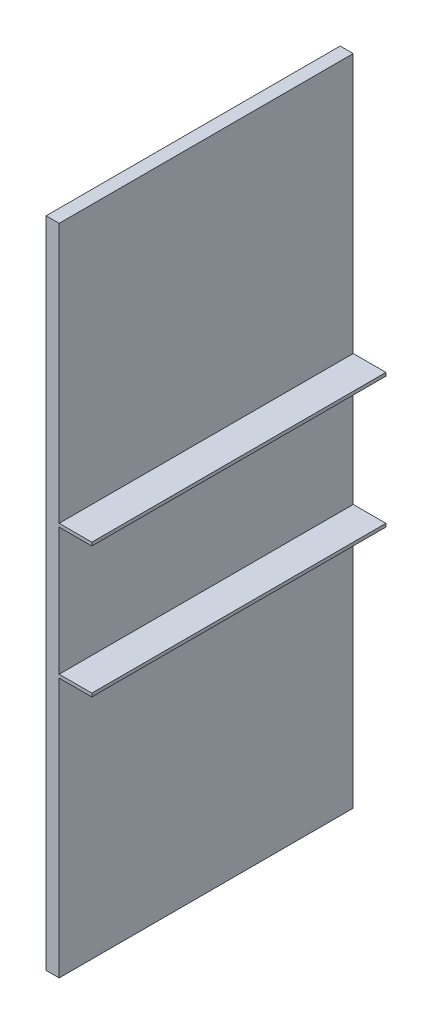
ISO-10303-21;
HEADER;
FILE_DESCRIPTION(('STEP AP214'),'2;1');
FILE_NAME('part.step','',(''),(''),'','','');
FILE_SCHEMA(('AUTOMOTIVE_DESIGN { 1 0 10303 214 1 1 1 1 }'));
ENDSEC;
DATA;
#1=APPLICATION_CONTEXT('core data for automotive mechanical design processes');
#2=APPLICATION_PROTOCOL_DEFINITION('international standard','automotive_design',2000,#1);
#3=PRODUCT_CONTEXT('',#1,'mechanical');
#4=PRODUCT('Part','Part','',(#3));
#5=PRODUCT_RELATED_PRODUCT_CATEGORY('part','',(#4));
#6=PRODUCT_DEFINITION_FORMATION('','',#4);
#7=PRODUCT_DEFINITION_CONTEXT('part definition',#1,'design');
#8=PRODUCT_DEFINITION('design','',#6,#7);
#9=PRODUCT_DEFINITION_SHAPE('','',#8);
#10=(LENGTH_UNIT() NAMED_UNIT(*) SI_UNIT(.MILLI.,.METRE.));
#11=(NAMED_UNIT(*) PLANE_ANGLE_UNIT() SI_UNIT($,.RADIAN.));
#12=(NAMED_UNIT(*) SI_UNIT($,.STERADIAN.) SOLID_ANGLE_UNIT());
#13=UNCERTAINTY_MEASURE_WITH_UNIT(LENGTH_MEASURE(1.E-05),#10,'distance_accuracy_value','');
#14=(GEOMETRIC_REPRESENTATION_CONTEXT(3) GLOBAL_UNCERTAINTY_ASSIGNED_CONTEXT((#13)) GLOBAL_UNIT_ASSIGNED_CONTEXT((#10,
#11,#12)) REPRESENTATION_CONTEXT('',''));
#15=CARTESIAN_POINT('',(0.,0.,0.));
#16=DIRECTION('',(0.,0.,1.));
#17=DIRECTION('',(1.,0.,0.));
#18=AXIS2_PLACEMENT_3D('',#15,#16,#17);
#19=CARTESIAN_POINT('',(-3.,0.,-45.));
#20=DIRECTION('',(-1.,0.,0.));
#21=DIRECTION('',(0.,0.,1.));
#22=AXIS2_PLACEMENT_3D('',#19,#20,#21);
#23=PLANE('',#22);
#24=DIRECTION('',(0.,0.,-1.));
#25=VECTOR('',#24,1.);
#26=CARTESIAN_POINT('',(-2.99999999999999,79.5,45.));
#27=LINE('',#26,#25);
#28=CARTESIAN_POINT('',(-2.99999999999999,79.5,45.));
#29=VERTEX_POINT('',#28);
#30=CARTESIAN_POINT('',(-3.,79.5,-45.));
#31=VERTEX_POINT('',#30);
#32=EDGE_CURVE('E246',#29,#31,#27,.T.);
#33=ORIENTED_EDGE('',*,*,#32,.F.);
#34=DIRECTION('',(0.,1.,0.));
#35=VECTOR('',#34,1.);
#36=CARTESIAN_POINT('',(-2.99999999999999,0.,45.));
#37=LINE('',#36,#35);
#38=CARTESIAN_POINT('',(-3.,0.,45.));
#39=VERTEX_POINT('',#38);
#40=EDGE_CURVE('E145',#39,#29,#37,.T.);
#41=ORIENTED_EDGE('',*,*,#40,.F.);
#42=DIRECTION('',(0.,0.,1.));
#43=VECTOR('',#42,1.);
#44=CARTESIAN_POINT('',(-3.,0.,-45.));
#45=LINE('',#44,#43);
#46=CARTESIAN_POINT('',(-3.,0.,-45.));
#47=VERTEX_POINT('',#46);
#48=EDGE_CURVE('E237',#47,#39,#45,.T.);
#49=ORIENTED_EDGE('',*,*,#48,.F.);
#50=DIRECTION('',(0.,1.,0.));
#51=VECTOR('',#50,1.);
#52=CARTESIAN_POINT('',(-3.,0.,-45.));
#53=LINE('',#52,#51);
#54=EDGE_CURVE('E235',#47,#31,#53,.T.);
#55=ORIENTED_EDGE('',*,*,#54,.T.);
#56=EDGE_LOOP('',(#33,#41,#49,#55));
#57=FACE_BOUND('',#56,.T.);
#58=ADVANCED_FACE('F32',(#57),#23,.F.);
#59=DIRECTION('',(0.,0.,1.));
#60=VECTOR('',#59,1.);
#61=CARTESIAN_POINT('',(-2.99999999999999,80.5,45.));
#62=LINE('',#61,#60);
#63=CARTESIAN_POINT('',(-3.,80.5,-45.));
#64=VERTEX_POINT('',#63);
#65=CARTESIAN_POINT('',(-2.99999999999999,80.5,45.));
#66=VERTEX_POINT('',#65);
#67=EDGE_CURVE('E140',#64,#66,#62,.T.);
#68=ORIENTED_EDGE('',*,*,#67,.F.);
#69=CARTESIAN_POINT('',(-3.,119.5,-45.));
#70=VERTEX_POINT('',#69);
#71=EDGE_CURVE('E36',#64,#70,#53,.T.);
#72=ORIENTED_EDGE('',*,*,#71,.T.);
#73=DIRECTION('',(0.,0.,-1.));
#74=VECTOR('',#73,1.);
#75=CARTESIAN_POINT('',(-2.99999999999999,119.5,45.));
#76=LINE('',#75,#74);
#77=CARTESIAN_POINT('',(-2.99999999999999,119.5,45.));
#78=VERTEX_POINT('',#77);
#79=EDGE_CURVE('E146',#78,#70,#76,.T.);
#80=ORIENTED_EDGE('',*,*,#79,.F.);
#81=EDGE_CURVE('E192',#66,#78,#37,.T.);
#82=ORIENTED_EDGE('',*,*,#81,.F.);
#83=EDGE_LOOP('',(#68,#72,#80,#82));
#84=FACE_BOUND('',#83,.T.);
#85=ADVANCED_FACE('F261',(#84),#23,.F.);
#86=DIRECTION('',(0.,0.,1.));
#87=VECTOR('',#86,1.);
#88=CARTESIAN_POINT('',(-2.99999999999999,120.5,45.));
#89=LINE('',#88,#87);
#90=CARTESIAN_POINT('',(-3.,120.5,-45.));
#91=VERTEX_POINT('',#90);
#92=CARTESIAN_POINT('',(-2.99999999999999,120.5,45.));
#93=VERTEX_POINT('',#92);
#94=EDGE_CURVE('E58',#91,#93,#89,.T.);
#95=ORIENTED_EDGE('',*,*,#94,.F.);
#96=CARTESIAN_POINT('',(-3.,200.,-45.));
#97=VERTEX_POINT('',#96);
#98=EDGE_CURVE('E170',#91,#97,#53,.T.);
#99=ORIENTED_EDGE('',*,*,#98,.T.);
#100=DIRECTION('',(0.,0.,1.));
#101=VECTOR('',#100,1.);
#102=CARTESIAN_POINT('',(-3.,200.,-45.));
#103=LINE('',#102,#101);
#104=CARTESIAN_POINT('',(-2.99999999999999,200.,45.));
#105=VERTEX_POINT('',#104);
#106=EDGE_CURVE('E181',#97,#105,#103,.T.);
#107=ORIENTED_EDGE('',*,*,#106,.T.);
#108=EDGE_CURVE('E194',#93,#105,#37,.T.);
#109=ORIENTED_EDGE('',*,*,#108,.F.);
#110=EDGE_LOOP('',(#95,#99,#107,#109));
#111=FACE_BOUND('',#110,.T.);
#112=ADVANCED_FACE('F236',(#111),#23,.F.);
#113=CARTESIAN_POINT('',(-7.,200.,-45.));
#114=DIRECTION('',(0.,0.,1.));
#115=DIRECTION('',(1.,0.,0.));
#116=AXIS2_PLACEMENT_3D('',#113,#114,#115);
#117=PLANE('',#116);
#118=DIRECTION('',(-1.,0.,0.));
#119=VECTOR('',#118,1.);
#120=CARTESIAN_POINT('',(-7.,200.,-45.));
#121=LINE('',#120,#119);
#122=CARTESIAN_POINT('',(-7.,200.,-45.));
#123=VERTEX_POINT('',#122);
#124=EDGE_CURVE('E210',#97,#123,#121,.T.);
#125=ORIENTED_EDGE('',*,*,#124,.F.);
#126=ORIENTED_EDGE('',*,*,#98,.F.);
#127=DIRECTION('',(-1.,0.,0.));
#128=VECTOR('',#127,1.);
#129=CARTESIAN_POINT('',(7.,120.5,-45.));
#130=LINE('',#129,#128);
#131=CARTESIAN_POINT('',(7.,120.5,-45.));
#132=VERTEX_POINT('',#131);
#133=EDGE_CURVE('E176',#132,#91,#130,.T.);
#134=ORIENTED_EDGE('',*,*,#133,.F.);
#135=DIRECTION('',(0.,1.,0.));
#136=VECTOR('',#135,1.);
#137=CARTESIAN_POINT('',(7.,120.5,-45.));
#138=LINE('',#137,#136);
#139=CARTESIAN_POINT('',(7.,119.5,-45.));
#140=VERTEX_POINT('',#139);
#141=EDGE_CURVE('E159',#140,#132,#138,.T.);
#142=ORIENTED_EDGE('',*,*,#141,.F.);
#143=DIRECTION('',(-1.,0.,0.));
#144=VECTOR('',#143,1.);
#145=CARTESIAN_POINT('',(7.,119.5,-45.));
#146=LINE('',#145,#144);
#147=EDGE_CURVE('E172',#140,#70,#146,.T.);
#148=ORIENTED_EDGE('',*,*,#147,.T.);
#149=ORIENTED_EDGE('',*,*,#71,.F.);
#150=DIRECTION('',(-1.,0.,0.));
#151=VECTOR('',#150,1.);
#152=CARTESIAN_POINT('',(7.,80.5,-45.));
#153=LINE('',#152,#151);
#154=CARTESIAN_POINT('',(7.,80.5,-45.));
#155=VERTEX_POINT('',#154);
#156=EDGE_CURVE('E150',#155,#64,#153,.T.);
#157=ORIENTED_EDGE('',*,*,#156,.F.);
#158=DIRECTION('',(0.,1.,0.));
#159=VECTOR('',#158,1.);
#160=CARTESIAN_POINT('',(7.,79.5,-45.));
#161=LINE('',#160,#159);
#162=CARTESIAN_POINT('',(7.,79.5,-45.));
#163=VERTEX_POINT('',#162);
#164=EDGE_CURVE('E134',#163,#155,#161,.T.);
#165=ORIENTED_EDGE('',*,*,#164,.F.);
#166=DIRECTION('',(-1.,0.,0.));
#167=VECTOR('',#166,1.);
#168=CARTESIAN_POINT('',(7.,79.5,-45.));
#169=LINE('',#168,#167);
#170=EDGE_CURVE('E131',#163,#31,#169,.T.);
#171=ORIENTED_EDGE('',*,*,#170,.T.);
#172=ORIENTED_EDGE('',*,*,#54,.F.);
#173=DIRECTION('',(-1.,0.,0.));
#174=VECTOR('',#173,1.);
#175=CARTESIAN_POINT('',(-7.,0.,-45.));
#176=LINE('',#175,#174);
#177=CARTESIAN_POINT('',(-7.,0.,-45.));
#178=VERTEX_POINT('',#177);
#179=EDGE_CURVE('E203',#47,#178,#176,.T.);
#180=ORIENTED_EDGE('',*,*,#179,.T.);
#181=DIRECTION('',(0.,-1.,0.));
#182=VECTOR('',#181,1.);
#183=CARTESIAN_POINT('',(-7.,200.,-45.));
#184=LINE('',#183,#182);
#185=EDGE_CURVE('E11',#123,#178,#184,.T.);
#186=ORIENTED_EDGE('',*,*,#185,.F.);
#187=EDGE_LOOP('',(#125,#126,#134,#142,#148,#149,#157,#165,#171,#172,#180,#186));
#188=FACE_BOUND('',#187,.T.);
#189=ADVANCED_FACE('F34',(#188),#117,.F.);
#190=CARTESIAN_POINT('',(-7.,200.,-45.));
#191=DIRECTION('',(1.,0.,0.));
#192=DIRECTION('',(0.,0.,-1.));
#193=AXIS2_PLACEMENT_3D('',#190,#191,#192);
#194=PLANE('',#193);
#195=DIRECTION('',(0.,0.,1.));
#196=VECTOR('',#195,1.);
#197=CARTESIAN_POINT('',(-7.,0.,-45.));
#198=LINE('',#197,#196);
#199=CARTESIAN_POINT('',(-6.99999999999999,0.,45.));
#200=VERTEX_POINT('',#199);
#201=EDGE_CURVE('E211',#178,#200,#198,.T.);
#202=ORIENTED_EDGE('',*,*,#201,.T.);
#203=DIRECTION('',(0.,-1.,0.));
#204=VECTOR('',#203,1.);
#205=CARTESIAN_POINT('',(-6.99999999999999,200.,45.));
#206=LINE('',#205,#204);
#207=CARTESIAN_POINT('',(-6.99999999999999,200.,45.));
#208=VERTEX_POINT('',#207);
#209=EDGE_CURVE('E42',#208,#200,#206,.T.);
#210=ORIENTED_EDGE('',*,*,#209,.F.);
#211=DIRECTION('',(0.,0.,1.));
#212=VECTOR('',#211,1.);
#213=CARTESIAN_POINT('',(-7.,200.,-45.));
#214=LINE('',#213,#212);
#215=EDGE_CURVE('E216',#123,#208,#214,.T.);
#216=ORIENTED_EDGE('',*,*,#215,.F.);
#217=ORIENTED_EDGE('',*,*,#185,.T.);
#218=EDGE_LOOP('',(#202,#210,#216,#217));
#219=FACE_BOUND('',#218,.T.);
#220=ADVANCED_FACE('F230',(#219),#194,.F.);
#221=CARTESIAN_POINT('',(-6.99999999999999,200.,45.));
#222=DIRECTION('',(0.,0.,-1.));
#223=DIRECTION('',(-1.,0.,0.));
#224=AXIS2_PLACEMENT_3D('',#221,#222,#223);
#225=PLANE('',#224);
#226=DIRECTION('',(1.,0.,0.));
#227=VECTOR('',#226,1.);
#228=CARTESIAN_POINT('',(-6.99999999999999,0.,45.));
#229=LINE('',#228,#227);
#230=EDGE_CURVE('E208',#200,#39,#229,.T.);
#231=ORIENTED_EDGE('',*,*,#230,.T.);
#232=ORIENTED_EDGE('',*,*,#40,.T.);
#233=DIRECTION('',(-1.,0.,0.));
#234=VECTOR('',#233,1.);
#235=CARTESIAN_POINT('',(7.00000000000001,79.5,45.));
#236=LINE('',#235,#234);
#237=CARTESIAN_POINT('',(7.00000000000001,79.5,45.));
#238=VERTEX_POINT('',#237);
#239=EDGE_CURVE('E128',#238,#29,#236,.T.);
#240=ORIENTED_EDGE('',*,*,#239,.F.);
#241=DIRECTION('',(0.,-1.,0.));
#242=VECTOR('',#241,1.);
#243=CARTESIAN_POINT('',(7.00000000000001,79.5,45.));
#244=LINE('',#243,#242);
#245=CARTESIAN_POINT('',(7.00000000000001,80.5,45.));
#246=VERTEX_POINT('',#245);
#247=EDGE_CURVE('E135',#246,#238,#244,.T.);
#248=ORIENTED_EDGE('',*,*,#247,.F.);
#249=DIRECTION('',(-1.,0.,0.));
#250=VECTOR('',#249,1.);
#251=CARTESIAN_POINT('',(7.00000000000001,80.5,45.));
#252=LINE('',#251,#250);
#253=EDGE_CURVE('E50',#246,#66,#252,.T.);
#254=ORIENTED_EDGE('',*,*,#253,.T.);
#255=ORIENTED_EDGE('',*,*,#81,.T.);
#256=DIRECTION('',(-1.,0.,0.));
#257=VECTOR('',#256,1.);
#258=CARTESIAN_POINT('',(7.00000000000001,119.5,45.));
#259=LINE('',#258,#257);
#260=CARTESIAN_POINT('',(7.00000000000001,119.5,45.));
#261=VERTEX_POINT('',#260);
#262=EDGE_CURVE('E175',#261,#78,#259,.T.);
#263=ORIENTED_EDGE('',*,*,#262,.F.);
#264=DIRECTION('',(0.,-1.,0.));
#265=VECTOR('',#264,1.);
#266=CARTESIAN_POINT('',(7.00000000000001,120.5,45.));
#267=LINE('',#266,#265);
#268=CARTESIAN_POINT('',(7.00000000000001,120.5,45.));
#269=VERTEX_POINT('',#268);
#270=EDGE_CURVE('E154',#269,#261,#267,.T.);
#271=ORIENTED_EDGE('',*,*,#270,.F.);
#272=DIRECTION('',(-1.,0.,0.));
#273=VECTOR('',#272,1.);
#274=CARTESIAN_POINT('',(7.00000000000001,120.5,45.));
#275=LINE('',#274,#273);
#276=EDGE_CURVE('E163',#269,#93,#275,.T.);
#277=ORIENTED_EDGE('',*,*,#276,.T.);
#278=ORIENTED_EDGE('',*,*,#108,.T.);
#279=DIRECTION('',(1.,0.,0.));
#280=VECTOR('',#279,1.);
#281=CARTESIAN_POINT('',(-6.99999999999999,200.,45.));
#282=LINE('',#281,#280);
#283=EDGE_CURVE('E207',#208,#105,#282,.T.);
#284=ORIENTED_EDGE('',*,*,#283,.F.);
#285=ORIENTED_EDGE('',*,*,#209,.T.);
#286=EDGE_LOOP('',(#231,#232,#240,#248,#254,#255,#263,#271,#277,#278,#284,#285));
#287=FACE_BOUND('',#286,.T.);
#288=ADVANCED_FACE('F144',(#287),#225,.F.);
#289=CARTESIAN_POINT('',(0.,200.,0.));
#290=DIRECTION('',(0.,1.,0.));
#291=DIRECTION('',(0.,0.,1.));
#292=AXIS2_PLACEMENT_3D('',#289,#290,#291);
#293=PLANE('',#292);
#294=ORIENTED_EDGE('',*,*,#106,.F.);
#295=ORIENTED_EDGE('',*,*,#124,.T.);
#296=ORIENTED_EDGE('',*,*,#215,.T.);
#297=ORIENTED_EDGE('',*,*,#283,.T.);
#298=EDGE_LOOP('',(#294,#295,#296,#297));
#299=FACE_BOUND('',#298,.T.);
#300=ADVANCED_FACE('F221',(#299),#293,.T.);
#301=CARTESIAN_POINT('',(0.,0.,0.));
#302=DIRECTION('',(0.,1.,0.));
#303=DIRECTION('',(0.,0.,1.));
#304=AXIS2_PLACEMENT_3D('',#301,#302,#303);
#305=PLANE('',#304);
#306=ORIENTED_EDGE('',*,*,#179,.F.);
#307=ORIENTED_EDGE('',*,*,#48,.T.);
#308=ORIENTED_EDGE('',*,*,#230,.F.);
#309=ORIENTED_EDGE('',*,*,#201,.F.);
#310=EDGE_LOOP('',(#306,#307,#308,#309));
#311=FACE_BOUND('',#310,.T.);
#312=ADVANCED_FACE('F247',(#311),#305,.F.);
#313=CARTESIAN_POINT('',(7.00000000000001,119.5,45.));
#314=DIRECTION('',(0.,1.,0.));
#315=DIRECTION('',(0.,0.,1.));
#316=AXIS2_PLACEMENT_3D('',#313,#314,#315);
#317=PLANE('',#316);
#318=ORIENTED_EDGE('',*,*,#79,.T.);
#319=ORIENTED_EDGE('',*,*,#147,.F.);
#320=DIRECTION('',(0.,0.,-1.));
#321=VECTOR('',#320,1.);
#322=CARTESIAN_POINT('',(7.00000000000001,119.5,45.));
#323=LINE('',#322,#321);
#324=EDGE_CURVE('E157',#261,#140,#323,.T.);
#325=ORIENTED_EDGE('',*,*,#324,.F.);
#326=ORIENTED_EDGE('',*,*,#262,.T.);
#327=EDGE_LOOP('',(#318,#319,#325,#326));
#328=FACE_BOUND('',#327,.T.);
#329=ADVANCED_FACE('F249',(#328),#317,.F.);
#330=CARTESIAN_POINT('',(7.00000000000001,120.5,45.));
#331=DIRECTION('',(0.,-1.,0.));
#332=DIRECTION('',(0.,0.,-1.));
#333=AXIS2_PLACEMENT_3D('',#330,#331,#332);
#334=PLANE('',#333);
#335=ORIENTED_EDGE('',*,*,#94,.T.);
#336=ORIENTED_EDGE('',*,*,#276,.F.);
#337=DIRECTION('',(0.,0.,1.));
#338=VECTOR('',#337,1.);
#339=CARTESIAN_POINT('',(7.00000000000001,120.5,45.));
#340=LINE('',#339,#338);
#341=EDGE_CURVE('E161',#132,#269,#340,.T.);
#342=ORIENTED_EDGE('',*,*,#341,.F.);
#343=ORIENTED_EDGE('',*,*,#133,.T.);
#344=EDGE_LOOP('',(#335,#336,#342,#343));
#345=FACE_BOUND('',#344,.T.);
#346=ADVANCED_FACE('F255',(#345),#334,.F.);
#347=CARTESIAN_POINT('',(7.,0.,0.));
#348=DIRECTION('',(1.,0.,0.));
#349=DIRECTION('',(0.,0.,-1.));
#350=AXIS2_PLACEMENT_3D('',#347,#348,#349);
#351=PLANE('',#350);
#352=ORIENTED_EDGE('',*,*,#270,.T.);
#353=ORIENTED_EDGE('',*,*,#324,.T.);
#354=ORIENTED_EDGE('',*,*,#141,.T.);
#355=ORIENTED_EDGE('',*,*,#341,.T.);
#356=EDGE_LOOP('',(#352,#353,#354,#355));
#357=FACE_BOUND('',#356,.T.);
#358=ADVANCED_FACE('F333',(#357),#351,.T.);
#359=CARTESIAN_POINT('',(7.00000000000001,79.5,45.));
#360=DIRECTION('',(0.,1.,0.));
#361=DIRECTION('',(0.,0.,1.));
#362=AXIS2_PLACEMENT_3D('',#359,#360,#361);
#363=PLANE('',#362);
#364=ORIENTED_EDGE('',*,*,#32,.T.);
#365=ORIENTED_EDGE('',*,*,#170,.F.);
#366=DIRECTION('',(0.,0.,-1.));
#367=VECTOR('',#366,1.);
#368=CARTESIAN_POINT('',(7.00000000000001,79.5,45.));
#369=LINE('',#368,#367);
#370=EDGE_CURVE('E124',#238,#163,#369,.T.);
#371=ORIENTED_EDGE('',*,*,#370,.F.);
#372=ORIENTED_EDGE('',*,*,#239,.T.);
#373=EDGE_LOOP('',(#364,#365,#371,#372));
#374=FACE_BOUND('',#373,.T.);
#375=ADVANCED_FACE('F126',(#374),#363,.F.);
#376=CARTESIAN_POINT('',(7.00000000000001,80.5,45.));
#377=DIRECTION('',(0.,-1.,0.));
#378=DIRECTION('',(0.,0.,-1.));
#379=AXIS2_PLACEMENT_3D('',#376,#377,#378);
#380=PLANE('',#379);
#381=ORIENTED_EDGE('',*,*,#67,.T.);
#382=ORIENTED_EDGE('',*,*,#253,.F.);
#383=DIRECTION('',(0.,0.,1.));
#384=VECTOR('',#383,1.);
#385=CARTESIAN_POINT('',(7.00000000000001,80.5,45.));
#386=LINE('',#385,#384);
#387=EDGE_CURVE('E139',#155,#246,#386,.T.);
#388=ORIENTED_EDGE('',*,*,#387,.F.);
#389=ORIENTED_EDGE('',*,*,#156,.T.);
#390=EDGE_LOOP('',(#381,#382,#388,#389));
#391=FACE_BOUND('',#390,.T.);
#392=ADVANCED_FACE('F350',(#391),#380,.F.);
#393=CARTESIAN_POINT('',(7.,0.,0.));
#394=DIRECTION('',(-1.,0.,0.));
#395=DIRECTION('',(0.,0.,1.));
#396=AXIS2_PLACEMENT_3D('',#393,#394,#395);
#397=PLANE('',#396);
#398=ORIENTED_EDGE('',*,*,#247,.T.);
#399=ORIENTED_EDGE('',*,*,#370,.T.);
#400=ORIENTED_EDGE('',*,*,#164,.T.);
#401=ORIENTED_EDGE('',*,*,#387,.T.);
#402=EDGE_LOOP('',(#398,#399,#400,#401));
#403=FACE_BOUND('',#402,.T.);
#404=ADVANCED_FACE('F137',(#403),#397,.F.);
#405=CLOSED_SHELL('',(#58,#85,#112,#189,#220,#288,#300,#312,#329,#346,#358,#375,#392,#404));
#406=MANIFOLD_SOLID_BREP('B2',#405);
#407=ADVANCED_BREP_SHAPE_REPRESENTATION('',(#18,#406),#14);
#408=SHAPE_DEFINITION_REPRESENTATION(#9,#407);
ENDSEC;
END-ISO-10303-21;
